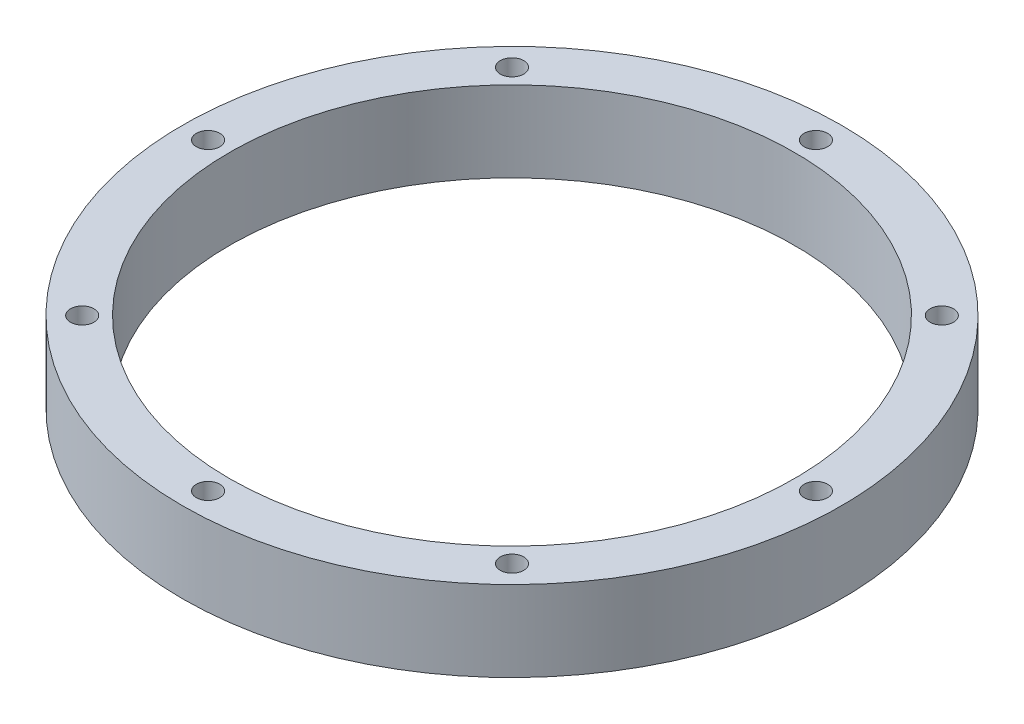
ISO-10303-21;
HEADER;
FILE_DESCRIPTION(('STEP AP214'),'2;1');
FILE_NAME('part.step','',(''),(''),'','','');
FILE_SCHEMA(('AUTOMOTIVE_DESIGN { 1 0 10303 214 1 1 1 1 }'));
ENDSEC;
DATA;
#1=APPLICATION_CONTEXT('core data for automotive mechanical design processes');
#2=APPLICATION_PROTOCOL_DEFINITION('international standard','automotive_design',2000,#1);
#3=PRODUCT_CONTEXT('',#1,'mechanical');
#4=PRODUCT('Part','Part','',(#3));
#5=PRODUCT_RELATED_PRODUCT_CATEGORY('part','',(#4));
#6=PRODUCT_DEFINITION_FORMATION('','',#4);
#7=PRODUCT_DEFINITION_CONTEXT('part definition',#1,'design');
#8=PRODUCT_DEFINITION('design','',#6,#7);
#9=PRODUCT_DEFINITION_SHAPE('','',#8);
#10=(LENGTH_UNIT() NAMED_UNIT(*) SI_UNIT(.MILLI.,.METRE.));
#11=(NAMED_UNIT(*) PLANE_ANGLE_UNIT() SI_UNIT($,.RADIAN.));
#12=(NAMED_UNIT(*) SI_UNIT($,.STERADIAN.) SOLID_ANGLE_UNIT());
#13=UNCERTAINTY_MEASURE_WITH_UNIT(LENGTH_MEASURE(1.E-05),#10,'distance_accuracy_value','');
#14=(GEOMETRIC_REPRESENTATION_CONTEXT(3) GLOBAL_UNCERTAINTY_ASSIGNED_CONTEXT((#13)) GLOBAL_UNIT_ASSIGNED_CONTEXT((#10,
#11,#12)) REPRESENTATION_CONTEXT('',''));
#15=CARTESIAN_POINT('',(0.,0.,0.));
#16=DIRECTION('',(0.,0.,1.));
#17=DIRECTION('',(1.,0.,0.));
#18=AXIS2_PLACEMENT_3D('',#15,#16,#17);
#19=CARTESIAN_POINT('',(0.,11.,0.));
#20=DIRECTION('',(0.,1.,0.));
#21=DIRECTION('',(0.,0.,1.));
#22=AXIS2_PLACEMENT_3D('',#19,#20,#21);
#23=PLANE('',#22);
#24=CARTESIAN_POINT('',(-41.5,11.,0.));
#25=DIRECTION('',(0.,1.,0.));
#26=DIRECTION('',(0.,0.,1.));
#27=AXIS2_PLACEMENT_3D('',#24,#25,#26);
#28=CIRCLE('',#27,1.6);
#29=CARTESIAN_POINT('',(-41.5,11.,1.6));
#30=VERTEX_POINT('',#29);
#31=EDGE_CURVE('E111',#30,#30,#28,.T.);
#32=ORIENTED_EDGE('',*,*,#31,.F.);
#33=EDGE_LOOP('',(#32));
#34=FACE_BOUND('',#33,.T.);
#35=CARTESIAN_POINT('',(0.,11.,41.5));
#36=DIRECTION('',(0.,1.,0.));
#37=DIRECTION('',(0.,0.,1.));
#38=AXIS2_PLACEMENT_3D('',#35,#36,#37);
#39=CIRCLE('',#38,1.6);
#40=CARTESIAN_POINT('',(0.,11.,43.1));
#41=VERTEX_POINT('',#40);
#42=EDGE_CURVE('E95',#41,#41,#39,.T.);
#43=ORIENTED_EDGE('',*,*,#42,.F.);
#44=EDGE_LOOP('',(#43));
#45=FACE_BOUND('',#44,.T.);
#46=CARTESIAN_POINT('',(41.5,11.,0.));
#47=DIRECTION('',(0.,1.,0.));
#48=DIRECTION('',(0.,0.,1.));
#49=AXIS2_PLACEMENT_3D('',#46,#47,#48);
#50=CIRCLE('',#49,1.6);
#51=CARTESIAN_POINT('',(41.5,11.,1.59999999999999));
#52=VERTEX_POINT('',#51);
#53=EDGE_CURVE('E79',#52,#52,#50,.T.);
#54=ORIENTED_EDGE('',*,*,#53,.F.);
#55=EDGE_LOOP('',(#54));
#56=FACE_BOUND('',#55,.T.);
#57=CARTESIAN_POINT('',(0.,11.,-41.5));
#58=DIRECTION('',(0.,1.,0.));
#59=DIRECTION('',(0.,0.,1.));
#60=AXIS2_PLACEMENT_3D('',#57,#58,#59);
#61=CIRCLE('',#60,1.6);
#62=CARTESIAN_POINT('',(0.,11.,-39.9));
#63=VERTEX_POINT('',#62);
#64=EDGE_CURVE('E63',#63,#63,#61,.T.);
#65=ORIENTED_EDGE('',*,*,#64,.F.);
#66=EDGE_LOOP('',(#65));
#67=FACE_BOUND('',#66,.T.);
#68=CARTESIAN_POINT('',(0.,11.,0.));
#69=DIRECTION('',(0.,1.,0.));
#70=DIRECTION('',(0.,0.,1.));
#71=AXIS2_PLACEMENT_3D('',#68,#69,#70);
#72=CIRCLE('',#71,45.);
#73=CARTESIAN_POINT('',(0.,11.,45.));
#74=VERTEX_POINT('',#73);
#75=EDGE_CURVE('E10',#74,#74,#72,.T.);
#76=ORIENTED_EDGE('',*,*,#75,.T.);
#77=EDGE_LOOP('',(#76));
#78=FACE_BOUND('',#77,.T.);
#79=CARTESIAN_POINT('',(0.,11.,0.));
#80=DIRECTION('',(0.,1.,0.));
#81=DIRECTION('',(0.,0.,1.));
#82=AXIS2_PLACEMENT_3D('',#79,#80,#81);
#83=CIRCLE('',#82,38.575);
#84=CARTESIAN_POINT('',(0.,11.,38.575));
#85=VERTEX_POINT('',#84);
#86=EDGE_CURVE('E57',#85,#85,#83,.T.);
#87=ORIENTED_EDGE('',*,*,#86,.F.);
#88=EDGE_LOOP('',(#87));
#89=FACE_BOUND('',#88,.T.);
#90=CARTESIAN_POINT('',(29.3449314192417,11.,-29.3449314192417));
#91=DIRECTION('',(0.,1.,0.));
#92=DIRECTION('',(0.,0.,1.));
#93=AXIS2_PLACEMENT_3D('',#90,#91,#92);
#94=CIRCLE('',#93,1.6);
#95=CARTESIAN_POINT('',(29.3449314192417,11.,-27.7449314192417));
#96=VERTEX_POINT('',#95);
#97=EDGE_CURVE('E71',#96,#96,#94,.T.);
#98=ORIENTED_EDGE('',*,*,#97,.F.);
#99=EDGE_LOOP('',(#98));
#100=FACE_BOUND('',#99,.T.);
#101=CARTESIAN_POINT('',(29.3449314192417,11.,29.3449314192417));
#102=DIRECTION('',(0.,1.,0.));
#103=DIRECTION('',(0.,0.,1.));
#104=AXIS2_PLACEMENT_3D('',#101,#102,#103);
#105=CIRCLE('',#104,1.6);
#106=CARTESIAN_POINT('',(29.3449314192417,11.,30.9449314192417));
#107=VERTEX_POINT('',#106);
#108=EDGE_CURVE('E87',#107,#107,#105,.T.);
#109=ORIENTED_EDGE('',*,*,#108,.F.);
#110=EDGE_LOOP('',(#109));
#111=FACE_BOUND('',#110,.T.);
#112=CARTESIAN_POINT('',(-29.3449314192417,11.,29.3449314192417));
#113=DIRECTION('',(0.,1.,0.));
#114=DIRECTION('',(0.,0.,1.));
#115=AXIS2_PLACEMENT_3D('',#112,#113,#114);
#116=CIRCLE('',#115,1.6);
#117=CARTESIAN_POINT('',(-29.3449314192417,11.,30.9449314192417));
#118=VERTEX_POINT('',#117);
#119=EDGE_CURVE('E103',#118,#118,#116,.T.);
#120=ORIENTED_EDGE('',*,*,#119,.F.);
#121=EDGE_LOOP('',(#120));
#122=FACE_BOUND('',#121,.T.);
#123=CARTESIAN_POINT('',(-29.3449314192417,11.,-29.3449314192417));
#124=DIRECTION('',(0.,1.,0.));
#125=DIRECTION('',(0.,0.,1.));
#126=AXIS2_PLACEMENT_3D('',#123,#124,#125);
#127=CIRCLE('',#126,1.6);
#128=CARTESIAN_POINT('',(-29.3449314192417,11.,-27.7449314192417));
#129=VERTEX_POINT('',#128);
#130=EDGE_CURVE('E119',#129,#129,#127,.T.);
#131=ORIENTED_EDGE('',*,*,#130,.F.);
#132=EDGE_LOOP('',(#131));
#133=FACE_BOUND('',#132,.T.);
#134=ADVANCED_FACE('F44',(#34,#45,#56,#67,#78,#89,#100,#111,#122,#133),#23,.T.);
#135=CARTESIAN_POINT('',(0.,0.,0.));
#136=DIRECTION('',(0.,1.,0.));
#137=DIRECTION('',(0.,0.,1.));
#138=AXIS2_PLACEMENT_3D('',#135,#136,#137);
#139=PLANE('',#138);
#140=CARTESIAN_POINT('',(0.,0.,0.));
#141=DIRECTION('',(0.,1.,0.));
#142=DIRECTION('',(0.,0.,1.));
#143=AXIS2_PLACEMENT_3D('',#140,#141,#142);
#144=CIRCLE('',#143,45.);
#145=CARTESIAN_POINT('',(0.,0.,45.));
#146=VERTEX_POINT('',#145);
#147=EDGE_CURVE('E48',#146,#146,#144,.T.);
#148=ORIENTED_EDGE('',*,*,#147,.F.);
#149=EDGE_LOOP('',(#148));
#150=FACE_BOUND('',#149,.T.);
#151=CARTESIAN_POINT('',(0.,0.,0.));
#152=DIRECTION('',(0.,1.,0.));
#153=DIRECTION('',(0.,0.,1.));
#154=AXIS2_PLACEMENT_3D('',#151,#152,#153);
#155=CIRCLE('',#154,38.575);
#156=CARTESIAN_POINT('',(0.,0.,38.575));
#157=VERTEX_POINT('',#156);
#158=EDGE_CURVE('E59',#157,#157,#155,.T.);
#159=ORIENTED_EDGE('',*,*,#158,.T.);
#160=EDGE_LOOP('',(#159));
#161=FACE_BOUND('',#160,.T.);
#162=CARTESIAN_POINT('',(0.,0.,-41.5));
#163=DIRECTION('',(0.,1.,0.));
#164=DIRECTION('',(0.,0.,1.));
#165=AXIS2_PLACEMENT_3D('',#162,#163,#164);
#166=CIRCLE('',#165,1.6);
#167=CARTESIAN_POINT('',(0.,0.,-39.9));
#168=VERTEX_POINT('',#167);
#169=EDGE_CURVE('E67',#168,#168,#166,.T.);
#170=ORIENTED_EDGE('',*,*,#169,.T.);
#171=EDGE_LOOP('',(#170));
#172=FACE_BOUND('',#171,.T.);
#173=CARTESIAN_POINT('',(29.3449314192417,0.,-29.3449314192417));
#174=DIRECTION('',(0.,1.,0.));
#175=DIRECTION('',(0.,0.,1.));
#176=AXIS2_PLACEMENT_3D('',#173,#174,#175);
#177=CIRCLE('',#176,1.6);
#178=CARTESIAN_POINT('',(29.3449314192417,0.,-27.7449314192417));
#179=VERTEX_POINT('',#178);
#180=EDGE_CURVE('E75',#179,#179,#177,.T.);
#181=ORIENTED_EDGE('',*,*,#180,.T.);
#182=EDGE_LOOP('',(#181));
#183=FACE_BOUND('',#182,.T.);
#184=CARTESIAN_POINT('',(41.5,0.,0.));
#185=DIRECTION('',(0.,1.,0.));
#186=DIRECTION('',(0.,0.,1.));
#187=AXIS2_PLACEMENT_3D('',#184,#185,#186);
#188=CIRCLE('',#187,1.6);
#189=CARTESIAN_POINT('',(41.5,0.,1.59999999999999));
#190=VERTEX_POINT('',#189);
#191=EDGE_CURVE('E83',#190,#190,#188,.T.);
#192=ORIENTED_EDGE('',*,*,#191,.T.);
#193=EDGE_LOOP('',(#192));
#194=FACE_BOUND('',#193,.T.);
#195=CARTESIAN_POINT('',(29.3449314192417,0.,29.3449314192417));
#196=DIRECTION('',(0.,1.,0.));
#197=DIRECTION('',(0.,0.,1.));
#198=AXIS2_PLACEMENT_3D('',#195,#196,#197);
#199=CIRCLE('',#198,1.6);
#200=CARTESIAN_POINT('',(29.3449314192417,0.,30.9449314192417));
#201=VERTEX_POINT('',#200);
#202=EDGE_CURVE('E91',#201,#201,#199,.T.);
#203=ORIENTED_EDGE('',*,*,#202,.T.);
#204=EDGE_LOOP('',(#203));
#205=FACE_BOUND('',#204,.T.);
#206=CARTESIAN_POINT('',(0.,0.,41.5));
#207=DIRECTION('',(0.,1.,0.));
#208=DIRECTION('',(0.,0.,1.));
#209=AXIS2_PLACEMENT_3D('',#206,#207,#208);
#210=CIRCLE('',#209,1.6);
#211=CARTESIAN_POINT('',(0.,0.,43.1));
#212=VERTEX_POINT('',#211);
#213=EDGE_CURVE('E99',#212,#212,#210,.T.);
#214=ORIENTED_EDGE('',*,*,#213,.T.);
#215=EDGE_LOOP('',(#214));
#216=FACE_BOUND('',#215,.T.);
#217=CARTESIAN_POINT('',(-29.3449314192417,0.,29.3449314192417));
#218=DIRECTION('',(0.,1.,0.));
#219=DIRECTION('',(0.,0.,1.));
#220=AXIS2_PLACEMENT_3D('',#217,#218,#219);
#221=CIRCLE('',#220,1.6);
#222=CARTESIAN_POINT('',(-29.3449314192417,0.,30.9449314192417));
#223=VERTEX_POINT('',#222);
#224=EDGE_CURVE('E107',#223,#223,#221,.T.);
#225=ORIENTED_EDGE('',*,*,#224,.T.);
#226=EDGE_LOOP('',(#225));
#227=FACE_BOUND('',#226,.T.);
#228=CARTESIAN_POINT('',(-41.5,0.,0.));
#229=DIRECTION('',(0.,1.,0.));
#230=DIRECTION('',(0.,0.,1.));
#231=AXIS2_PLACEMENT_3D('',#228,#229,#230);
#232=CIRCLE('',#231,1.6);
#233=CARTESIAN_POINT('',(-41.5,0.,1.6));
#234=VERTEX_POINT('',#233);
#235=EDGE_CURVE('E115',#234,#234,#232,.T.);
#236=ORIENTED_EDGE('',*,*,#235,.T.);
#237=EDGE_LOOP('',(#236));
#238=FACE_BOUND('',#237,.T.);
#239=CARTESIAN_POINT('',(-29.3449314192417,0.,-29.3449314192417));
#240=DIRECTION('',(0.,1.,0.));
#241=DIRECTION('',(0.,0.,1.));
#242=AXIS2_PLACEMENT_3D('',#239,#240,#241);
#243=CIRCLE('',#242,1.6);
#244=CARTESIAN_POINT('',(-29.3449314192417,0.,-27.7449314192417));
#245=VERTEX_POINT('',#244);
#246=EDGE_CURVE('E123',#245,#245,#243,.T.);
#247=ORIENTED_EDGE('',*,*,#246,.T.);
#248=EDGE_LOOP('',(#247));
#249=FACE_BOUND('',#248,.T.);
#250=ADVANCED_FACE('F135',(#150,#161,#172,#183,#194,#205,#216,#227,#238,#249),#139,.F.);
#251=CARTESIAN_POINT('',(0.,11.,0.));
#252=DIRECTION('',(0.,-1.,0.));
#253=DIRECTION('',(0.,0.,-1.));
#254=AXIS2_PLACEMENT_3D('',#251,#252,#253);
#255=CYLINDRICAL_SURFACE('',#254,45.);
#256=ORIENTED_EDGE('',*,*,#75,.F.);
#257=EDGE_LOOP('',(#256));
#258=FACE_BOUND('',#257,.T.);
#259=ORIENTED_EDGE('',*,*,#147,.T.);
#260=EDGE_LOOP('',(#259));
#261=FACE_BOUND('',#260,.T.);
#262=ADVANCED_FACE('F46',(#258,#261),#255,.T.);
#263=CARTESIAN_POINT('',(0.,11.,0.));
#264=DIRECTION('',(0.,-1.,0.));
#265=DIRECTION('',(0.,0.,-1.));
#266=AXIS2_PLACEMENT_3D('',#263,#264,#265);
#267=CYLINDRICAL_SURFACE('',#266,38.575);
#268=ORIENTED_EDGE('',*,*,#86,.T.);
#269=EDGE_LOOP('',(#268));
#270=FACE_BOUND('',#269,.T.);
#271=ORIENTED_EDGE('',*,*,#158,.F.);
#272=EDGE_LOOP('',(#271));
#273=FACE_BOUND('',#272,.T.);
#274=ADVANCED_FACE('F145',(#270,#273),#267,.F.);
#275=CARTESIAN_POINT('',(0.,11.,-41.5));
#276=DIRECTION('',(0.,-1.,0.));
#277=DIRECTION('',(0.,0.,-1.));
#278=AXIS2_PLACEMENT_3D('',#275,#276,#277);
#279=CYLINDRICAL_SURFACE('',#278,1.6);
#280=ORIENTED_EDGE('',*,*,#64,.T.);
#281=EDGE_LOOP('',(#280));
#282=FACE_BOUND('',#281,.T.);
#283=ORIENTED_EDGE('',*,*,#169,.F.);
#284=EDGE_LOOP('',(#283));
#285=FACE_BOUND('',#284,.T.);
#286=ADVANCED_FACE('F148',(#282,#285),#279,.F.);
#287=CARTESIAN_POINT('',(29.3449314192417,11.,-29.3449314192417));
#288=DIRECTION('',(0.,-1.,0.));
#289=DIRECTION('',(0.,0.,-1.));
#290=AXIS2_PLACEMENT_3D('',#287,#288,#289);
#291=CYLINDRICAL_SURFACE('',#290,1.6);
#292=ORIENTED_EDGE('',*,*,#97,.T.);
#293=EDGE_LOOP('',(#292));
#294=FACE_BOUND('',#293,.T.);
#295=ORIENTED_EDGE('',*,*,#180,.F.);
#296=EDGE_LOOP('',(#295));
#297=FACE_BOUND('',#296,.T.);
#298=ADVANCED_FACE('F152',(#294,#297),#291,.F.);
#299=CARTESIAN_POINT('',(41.5,11.,0.));
#300=DIRECTION('',(0.,-1.,0.));
#301=DIRECTION('',(0.,0.,-1.));
#302=AXIS2_PLACEMENT_3D('',#299,#300,#301);
#303=CYLINDRICAL_SURFACE('',#302,1.6);
#304=ORIENTED_EDGE('',*,*,#53,.T.);
#305=EDGE_LOOP('',(#304));
#306=FACE_BOUND('',#305,.T.);
#307=ORIENTED_EDGE('',*,*,#191,.F.);
#308=EDGE_LOOP('',(#307));
#309=FACE_BOUND('',#308,.T.);
#310=ADVANCED_FACE('F156',(#306,#309),#303,.F.);
#311=CARTESIAN_POINT('',(29.3449314192417,11.,29.3449314192417));
#312=DIRECTION('',(0.,-1.,0.));
#313=DIRECTION('',(0.,0.,-1.));
#314=AXIS2_PLACEMENT_3D('',#311,#312,#313);
#315=CYLINDRICAL_SURFACE('',#314,1.6);
#316=ORIENTED_EDGE('',*,*,#108,.T.);
#317=EDGE_LOOP('',(#316));
#318=FACE_BOUND('',#317,.T.);
#319=ORIENTED_EDGE('',*,*,#202,.F.);
#320=EDGE_LOOP('',(#319));
#321=FACE_BOUND('',#320,.T.);
#322=ADVANCED_FACE('F160',(#318,#321),#315,.F.);
#323=CARTESIAN_POINT('',(0.,11.,41.5));
#324=DIRECTION('',(0.,-1.,0.));
#325=DIRECTION('',(0.,0.,-1.));
#326=AXIS2_PLACEMENT_3D('',#323,#324,#325);
#327=CYLINDRICAL_SURFACE('',#326,1.6);
#328=ORIENTED_EDGE('',*,*,#42,.T.);
#329=EDGE_LOOP('',(#328));
#330=FACE_BOUND('',#329,.T.);
#331=ORIENTED_EDGE('',*,*,#213,.F.);
#332=EDGE_LOOP('',(#331));
#333=FACE_BOUND('',#332,.T.);
#334=ADVANCED_FACE('F164',(#330,#333),#327,.F.);
#335=CARTESIAN_POINT('',(-29.3449314192417,11.,29.3449314192417));
#336=DIRECTION('',(0.,-1.,0.));
#337=DIRECTION('',(0.,0.,-1.));
#338=AXIS2_PLACEMENT_3D('',#335,#336,#337);
#339=CYLINDRICAL_SURFACE('',#338,1.6);
#340=ORIENTED_EDGE('',*,*,#119,.T.);
#341=EDGE_LOOP('',(#340));
#342=FACE_BOUND('',#341,.T.);
#343=ORIENTED_EDGE('',*,*,#224,.F.);
#344=EDGE_LOOP('',(#343));
#345=FACE_BOUND('',#344,.T.);
#346=ADVANCED_FACE('F168',(#342,#345),#339,.F.);
#347=CARTESIAN_POINT('',(-41.5,11.,0.));
#348=DIRECTION('',(0.,-1.,0.));
#349=DIRECTION('',(0.,0.,-1.));
#350=AXIS2_PLACEMENT_3D('',#347,#348,#349);
#351=CYLINDRICAL_SURFACE('',#350,1.6);
#352=ORIENTED_EDGE('',*,*,#31,.T.);
#353=EDGE_LOOP('',(#352));
#354=FACE_BOUND('',#353,.T.);
#355=ORIENTED_EDGE('',*,*,#235,.F.);
#356=EDGE_LOOP('',(#355));
#357=FACE_BOUND('',#356,.T.);
#358=ADVANCED_FACE('F172',(#354,#357),#351,.F.);
#359=CARTESIAN_POINT('',(-29.3449314192417,11.,-29.3449314192417));
#360=DIRECTION('',(0.,-1.,0.));
#361=DIRECTION('',(0.,0.,-1.));
#362=AXIS2_PLACEMENT_3D('',#359,#360,#361);
#363=CYLINDRICAL_SURFACE('',#362,1.6);
#364=ORIENTED_EDGE('',*,*,#130,.T.);
#365=EDGE_LOOP('',(#364));
#366=FACE_BOUND('',#365,.T.);
#367=ORIENTED_EDGE('',*,*,#246,.F.);
#368=EDGE_LOOP('',(#367));
#369=FACE_BOUND('',#368,.T.);
#370=ADVANCED_FACE('F131',(#366,#369),#363,.F.);
#371=CLOSED_SHELL('',(#134,#250,#262,#274,#286,#298,#310,#322,#334,#346,#358,#370));
#372=MANIFOLD_SOLID_BREP('B2',#371);
#373=ADVANCED_BREP_SHAPE_REPRESENTATION('',(#18,#372),#14);
#374=SHAPE_DEFINITION_REPRESENTATION(#9,#373);
ENDSEC;
END-ISO-10303-21;
